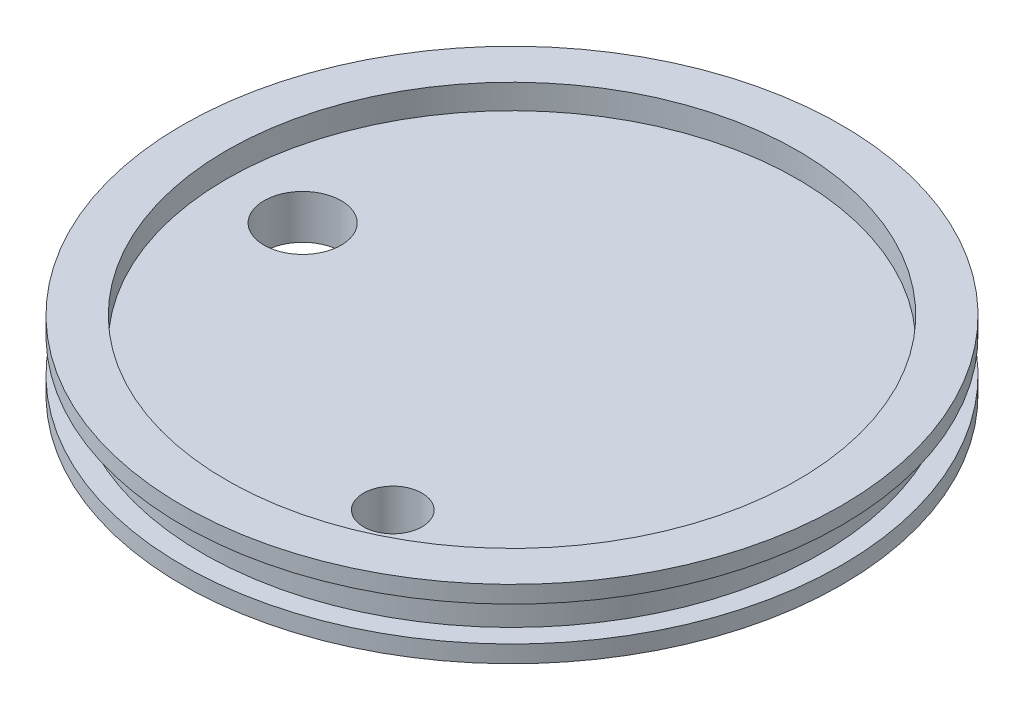
ISO-10303-21;
HEADER;
FILE_DESCRIPTION(('STEP AP214'),'2;1');
FILE_NAME('part.step','',(''),(''),'','','');
FILE_SCHEMA(('AUTOMOTIVE_DESIGN { 1 0 10303 214 1 1 1 1 }'));
ENDSEC;
DATA;
#1=APPLICATION_CONTEXT('core data for automotive mechanical design processes');
#2=APPLICATION_PROTOCOL_DEFINITION('international standard','automotive_design',2000,#1);
#3=PRODUCT_CONTEXT('',#1,'mechanical');
#4=PRODUCT('Part','Part','',(#3));
#5=PRODUCT_RELATED_PRODUCT_CATEGORY('part','',(#4));
#6=PRODUCT_DEFINITION_FORMATION('','',#4);
#7=PRODUCT_DEFINITION_CONTEXT('part definition',#1,'design');
#8=PRODUCT_DEFINITION('design','',#6,#7);
#9=PRODUCT_DEFINITION_SHAPE('','',#8);
#10=(LENGTH_UNIT() NAMED_UNIT(*) SI_UNIT(.MILLI.,.METRE.));
#11=(NAMED_UNIT(*) PLANE_ANGLE_UNIT() SI_UNIT($,.RADIAN.));
#12=(NAMED_UNIT(*) SI_UNIT($,.STERADIAN.) SOLID_ANGLE_UNIT());
#13=UNCERTAINTY_MEASURE_WITH_UNIT(LENGTH_MEASURE(1.E-05),#10,'distance_accuracy_value','');
#14=(GEOMETRIC_REPRESENTATION_CONTEXT(3) GLOBAL_UNCERTAINTY_ASSIGNED_CONTEXT((#13)) GLOBAL_UNIT_ASSIGNED_CONTEXT((#10,
#11,#12)) REPRESENTATION_CONTEXT('',''));
#15=CARTESIAN_POINT('',(0.,0.,0.));
#16=DIRECTION('',(0.,0.,1.));
#17=DIRECTION('',(1.,0.,0.));
#18=AXIS2_PLACEMENT_3D('',#15,#16,#17);
#19=CARTESIAN_POINT('',(0.,0.,0.));
#20=DIRECTION('',(0.,1.,0.));
#21=DIRECTION('',(-1.,0.,0.));
#22=AXIS2_PLACEMENT_3D('',#19,#20,#21);
#23=PLANE('',#22);
#24=CARTESIAN_POINT('',(12.1501989775916,0.,29.3331751572333));
#25=DIRECTION('',(0.,1.,0.));
#26=DIRECTION('',(0.,0.,1.));
#27=AXIS2_PLACEMENT_3D('',#24,#25,#26);
#28=CIRCLE('',#27,4.2164);
#29=CARTESIAN_POINT('',(12.1501989775916,0.,33.5495751572333));
#30=VERTEX_POINT('',#29);
#31=EDGE_CURVE('E71',#30,#30,#28,.T.);
#32=ORIENTED_EDGE('',*,*,#31,.T.);
#33=EDGE_LOOP('',(#32));
#34=FACE_BOUND('',#33,.T.);
#35=CARTESIAN_POINT('',(-30.1752,0.,0.));
#36=DIRECTION('',(0.,1.,0.));
#37=DIRECTION('',(0.,0.,1.));
#38=AXIS2_PLACEMENT_3D('',#35,#36,#37);
#39=CIRCLE('',#38,5.5626);
#40=CARTESIAN_POINT('',(-30.1752,0.,5.5626));
#41=VERTEX_POINT('',#40);
#42=EDGE_CURVE('E65',#41,#41,#39,.T.);
#43=ORIENTED_EDGE('',*,*,#42,.T.);
#44=EDGE_LOOP('',(#43));
#45=FACE_BOUND('',#44,.T.);
#46=CARTESIAN_POINT('',(0.,0.,0.));
#47=DIRECTION('',(0.,1.,0.));
#48=DIRECTION('',(-1.,0.,0.));
#49=AXIS2_PLACEMENT_3D('',#46,#47,#48);
#50=CIRCLE('',#49,47.498);
#51=CARTESIAN_POINT('',(-47.498,0.,0.));
#52=VERTEX_POINT('',#51);
#53=EDGE_CURVE('E10',#52,#52,#50,.T.);
#54=ORIENTED_EDGE('',*,*,#53,.F.);
#55=EDGE_LOOP('',(#54));
#56=FACE_BOUND('',#55,.T.);
#57=ADVANCED_FACE('F34',(#34,#45,#56),#23,.F.);
#58=CARTESIAN_POINT('',(0.,48.1922132313012,0.));
#59=DIRECTION('',(0.,1.,0.));
#60=DIRECTION('',(-1.,0.,0.));
#61=AXIS2_PLACEMENT_3D('',#58,#59,#60);
#62=CYLINDRICAL_SURFACE('',#61,47.498);
#63=CARTESIAN_POINT('',(0.,2.4638,0.));
#64=DIRECTION('',(0.,1.,0.));
#65=DIRECTION('',(-1.,0.,0.));
#66=AXIS2_PLACEMENT_3D('',#63,#64,#65);
#67=CIRCLE('',#66,47.498);
#68=CARTESIAN_POINT('',(-47.498,2.46379999999999,0.));
#69=VERTEX_POINT('',#68);
#70=EDGE_CURVE('E40',#69,#69,#67,.T.);
#71=ORIENTED_EDGE('',*,*,#70,.F.);
#72=EDGE_LOOP('',(#71));
#73=FACE_BOUND('',#72,.T.);
#74=ORIENTED_EDGE('',*,*,#53,.T.);
#75=EDGE_LOOP('',(#74));
#76=FACE_BOUND('',#75,.T.);
#77=ADVANCED_FACE('F121',(#73,#76),#62,.T.);
#78=CARTESIAN_POINT('',(47.498,2.4638,0.));
#79=DIRECTION('',(0.,-1.,0.));
#80=DIRECTION('',(1.,0.,0.));
#81=AXIS2_PLACEMENT_3D('',#78,#79,#80);
#82=PLANE('',#81);
#83=CARTESIAN_POINT('',(0.,2.4638,0.));
#84=DIRECTION('',(0.,1.,0.));
#85=DIRECTION('',(-1.,0.,0.));
#86=AXIS2_PLACEMENT_3D('',#83,#84,#85);
#87=CIRCLE('',#86,44.577);
#88=CARTESIAN_POINT('',(-44.577,2.46379999999999,0.));
#89=VERTEX_POINT('',#88);
#90=EDGE_CURVE('E44',#89,#89,#87,.T.);
#91=ORIENTED_EDGE('',*,*,#90,.F.);
#92=EDGE_LOOP('',(#91));
#93=FACE_BOUND('',#92,.T.);
#94=ORIENTED_EDGE('',*,*,#70,.T.);
#95=EDGE_LOOP('',(#94));
#96=FACE_BOUND('',#95,.T.);
#97=ADVANCED_FACE('F116',(#93,#96),#82,.F.);
#98=CARTESIAN_POINT('',(0.,48.1922132313012,0.));
#99=DIRECTION('',(0.,1.,0.));
#100=DIRECTION('',(-1.,0.,0.));
#101=AXIS2_PLACEMENT_3D('',#98,#99,#100);
#102=CYLINDRICAL_SURFACE('',#101,44.577);
#103=CARTESIAN_POINT('',(0.,7.44219999999999,0.));
#104=DIRECTION('',(0.,1.,0.));
#105=DIRECTION('',(-1.,0.,0.));
#106=AXIS2_PLACEMENT_3D('',#103,#104,#105);
#107=CIRCLE('',#106,44.577);
#108=CARTESIAN_POINT('',(-44.577,7.44219999999998,0.));
#109=VERTEX_POINT('',#108);
#110=EDGE_CURVE('E48',#109,#109,#107,.T.);
#111=ORIENTED_EDGE('',*,*,#110,.F.);
#112=EDGE_LOOP('',(#111));
#113=FACE_BOUND('',#112,.T.);
#114=ORIENTED_EDGE('',*,*,#90,.T.);
#115=EDGE_LOOP('',(#114));
#116=FACE_BOUND('',#115,.T.);
#117=ADVANCED_FACE('F110',(#113,#116),#102,.T.);
#118=CARTESIAN_POINT('',(44.577,7.4422,0.));
#119=DIRECTION('',(0.,1.,0.));
#120=DIRECTION('',(-1.,0.,0.));
#121=AXIS2_PLACEMENT_3D('',#118,#119,#120);
#122=PLANE('',#121);
#123=CARTESIAN_POINT('',(0.,7.44219999999999,0.));
#124=DIRECTION('',(0.,1.,0.));
#125=DIRECTION('',(-1.,0.,0.));
#126=AXIS2_PLACEMENT_3D('',#123,#124,#125);
#127=CIRCLE('',#126,47.498);
#128=CARTESIAN_POINT('',(-47.498,7.44219999999998,0.));
#129=VERTEX_POINT('',#128);
#130=EDGE_CURVE('E53',#129,#129,#127,.T.);
#131=ORIENTED_EDGE('',*,*,#130,.F.);
#132=EDGE_LOOP('',(#131));
#133=FACE_BOUND('',#132,.T.);
#134=ORIENTED_EDGE('',*,*,#110,.T.);
#135=EDGE_LOOP('',(#134));
#136=FACE_BOUND('',#135,.T.);
#137=ADVANCED_FACE('F104',(#133,#136),#122,.F.);
#138=CARTESIAN_POINT('',(0.,48.1922132313012,0.));
#139=DIRECTION('',(0.,1.,0.));
#140=DIRECTION('',(-1.,0.,0.));
#141=AXIS2_PLACEMENT_3D('',#138,#139,#140);
#142=CYLINDRICAL_SURFACE('',#141,47.498);
#143=CARTESIAN_POINT('',(0.,9.90599999999999,0.));
#144=DIRECTION('',(0.,1.,0.));
#145=DIRECTION('',(-1.,0.,0.));
#146=AXIS2_PLACEMENT_3D('',#143,#144,#145);
#147=CIRCLE('',#146,47.498);
#148=CARTESIAN_POINT('',(-47.498,9.90599999999999,0.));
#149=VERTEX_POINT('',#148);
#150=EDGE_CURVE('E56',#149,#149,#147,.T.);
#151=ORIENTED_EDGE('',*,*,#150,.F.);
#152=EDGE_LOOP('',(#151));
#153=FACE_BOUND('',#152,.T.);
#154=ORIENTED_EDGE('',*,*,#130,.T.);
#155=EDGE_LOOP('',(#154));
#156=FACE_BOUND('',#155,.T.);
#157=ADVANCED_FACE('F98',(#153,#156),#142,.T.);
#158=CARTESIAN_POINT('',(47.498,9.906,0.));
#159=DIRECTION('',(0.,-1.,0.));
#160=DIRECTION('',(1.,0.,0.));
#161=AXIS2_PLACEMENT_3D('',#158,#159,#160);
#162=PLANE('',#161);
#163=CARTESIAN_POINT('',(0.,9.90599999999999,0.));
#164=DIRECTION('',(0.,1.,0.));
#165=DIRECTION('',(-1.,0.,0.));
#166=AXIS2_PLACEMENT_3D('',#163,#164,#165);
#167=CIRCLE('',#166,41.148);
#168=CARTESIAN_POINT('',(-41.148,9.90599999999999,0.));
#169=VERTEX_POINT('',#168);
#170=EDGE_CURVE('E59',#169,#169,#167,.T.);
#171=ORIENTED_EDGE('',*,*,#170,.F.);
#172=EDGE_LOOP('',(#171));
#173=FACE_BOUND('',#172,.T.);
#174=ORIENTED_EDGE('',*,*,#150,.T.);
#175=EDGE_LOOP('',(#174));
#176=FACE_BOUND('',#175,.T.);
#177=ADVANCED_FACE('F92',(#173,#176),#162,.F.);
#178=CARTESIAN_POINT('',(0.,48.1922132313012,0.));
#179=DIRECTION('',(0.,1.,0.));
#180=DIRECTION('',(-1.,0.,0.));
#181=AXIS2_PLACEMENT_3D('',#178,#179,#180);
#182=CYLINDRICAL_SURFACE('',#181,41.148);
#183=CARTESIAN_POINT('',(0.,6.34999999999999,0.));
#184=DIRECTION('',(0.,1.,0.));
#185=DIRECTION('',(-1.,0.,0.));
#186=AXIS2_PLACEMENT_3D('',#183,#184,#185);
#187=CIRCLE('',#186,41.148);
#188=CARTESIAN_POINT('',(-41.148,6.34999999999999,0.));
#189=VERTEX_POINT('',#188);
#190=EDGE_CURVE('E62',#189,#189,#187,.T.);
#191=ORIENTED_EDGE('',*,*,#190,.F.);
#192=EDGE_LOOP('',(#191));
#193=FACE_BOUND('',#192,.T.);
#194=ORIENTED_EDGE('',*,*,#170,.T.);
#195=EDGE_LOOP('',(#194));
#196=FACE_BOUND('',#195,.T.);
#197=ADVANCED_FACE('F84',(#193,#196),#182,.F.);
#198=CARTESIAN_POINT('',(41.148,6.35,0.));
#199=DIRECTION('',(0.,-1.,0.));
#200=DIRECTION('',(1.,0.,0.));
#201=AXIS2_PLACEMENT_3D('',#198,#199,#200);
#202=PLANE('',#201);
#203=CARTESIAN_POINT('',(12.1501989775916,6.35,29.3331751572333));
#204=DIRECTION('',(0.,1.,0.));
#205=DIRECTION('',(0.,0.,1.));
#206=AXIS2_PLACEMENT_3D('',#203,#204,#205);
#207=CIRCLE('',#206,4.2164);
#208=CARTESIAN_POINT('',(12.1501989775916,6.35,33.5495751572333));
#209=VERTEX_POINT('',#208);
#210=EDGE_CURVE('E74',#209,#209,#207,.T.);
#211=ORIENTED_EDGE('',*,*,#210,.F.);
#212=EDGE_LOOP('',(#211));
#213=FACE_BOUND('',#212,.T.);
#214=CARTESIAN_POINT('',(-30.1752,6.34999999999999,0.));
#215=DIRECTION('',(0.,1.,0.));
#216=DIRECTION('',(0.,0.,1.));
#217=AXIS2_PLACEMENT_3D('',#214,#215,#216);
#218=CIRCLE('',#217,5.56259999999999);
#219=CARTESIAN_POINT('',(-30.1752,6.34999999999999,5.56259999999999));
#220=VERTEX_POINT('',#219);
#221=EDGE_CURVE('E68',#220,#220,#218,.T.);
#222=ORIENTED_EDGE('',*,*,#221,.F.);
#223=EDGE_LOOP('',(#222));
#224=FACE_BOUND('',#223,.T.);
#225=ORIENTED_EDGE('',*,*,#190,.T.);
#226=EDGE_LOOP('',(#225));
#227=FACE_BOUND('',#226,.T.);
#228=ADVANCED_FACE('F80',(#213,#224,#227),#202,.F.);
#229=CARTESIAN_POINT('',(-30.1752,6.34999999999999,0.));
#230=DIRECTION('',(0.,1.,0.));
#231=DIRECTION('',(0.,0.,1.));
#232=AXIS2_PLACEMENT_3D('',#229,#230,#231);
#233=CYLINDRICAL_SURFACE('',#232,5.56259999999999);
#234=ORIENTED_EDGE('',*,*,#42,.F.);
#235=EDGE_LOOP('',(#234));
#236=FACE_BOUND('',#235,.T.);
#237=ORIENTED_EDGE('',*,*,#221,.T.);
#238=EDGE_LOOP('',(#237));
#239=FACE_BOUND('',#238,.T.);
#240=ADVANCED_FACE('F83',(#236,#239),#233,.F.);
#241=CARTESIAN_POINT('',(12.1501989775916,6.35,29.3331751572333));
#242=DIRECTION('',(0.,1.,0.));
#243=DIRECTION('',(0.,0.,1.));
#244=AXIS2_PLACEMENT_3D('',#241,#242,#243);
#245=CYLINDRICAL_SURFACE('',#244,4.2164);
#246=ORIENTED_EDGE('',*,*,#31,.F.);
#247=EDGE_LOOP('',(#246));
#248=FACE_BOUND('',#247,.T.);
#249=ORIENTED_EDGE('',*,*,#210,.T.);
#250=EDGE_LOOP('',(#249));
#251=FACE_BOUND('',#250,.T.);
#252=ADVANCED_FACE('F78',(#248,#251),#245,.F.);
#253=CLOSED_SHELL('',(#57,#77,#97,#117,#137,#157,#177,#197,#228,#240,#252));
#254=MANIFOLD_SOLID_BREP('B2',#253);
#255=ADVANCED_BREP_SHAPE_REPRESENTATION('',(#18,#254),#14);
#256=SHAPE_DEFINITION_REPRESENTATION(#9,#255);
ENDSEC;
END-ISO-10303-21;
